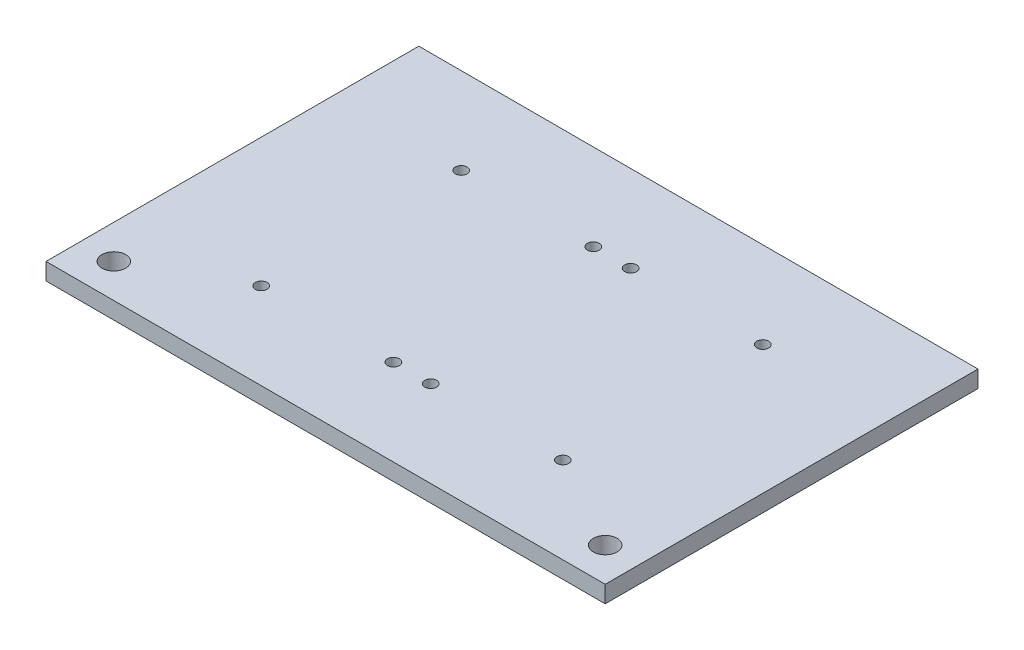
ISO-10303-21;
HEADER;
FILE_DESCRIPTION(('STEP AP214'),'2;1');
FILE_NAME('part.step','',(''),(''),'','','');
FILE_SCHEMA(('AUTOMOTIVE_DESIGN { 1 0 10303 214 1 1 1 1 }'));
ENDSEC;
DATA;
#1=APPLICATION_CONTEXT('core data for automotive mechanical design processes');
#2=APPLICATION_PROTOCOL_DEFINITION('international standard','automotive_design',2000,#1);
#3=PRODUCT_CONTEXT('',#1,'mechanical');
#4=PRODUCT('Part','Part','',(#3));
#5=PRODUCT_RELATED_PRODUCT_CATEGORY('part','',(#4));
#6=PRODUCT_DEFINITION_FORMATION('','',#4);
#7=PRODUCT_DEFINITION_CONTEXT('part definition',#1,'design');
#8=PRODUCT_DEFINITION('design','',#6,#7);
#9=PRODUCT_DEFINITION_SHAPE('','',#8);
#10=(LENGTH_UNIT() NAMED_UNIT(*) SI_UNIT(.MILLI.,.METRE.));
#11=(NAMED_UNIT(*) PLANE_ANGLE_UNIT() SI_UNIT($,.RADIAN.));
#12=(NAMED_UNIT(*) SI_UNIT($,.STERADIAN.) SOLID_ANGLE_UNIT());
#13=UNCERTAINTY_MEASURE_WITH_UNIT(LENGTH_MEASURE(1.E-05),#10,'distance_accuracy_value','');
#14=(GEOMETRIC_REPRESENTATION_CONTEXT(3) GLOBAL_UNCERTAINTY_ASSIGNED_CONTEXT((#13)) GLOBAL_UNIT_ASSIGNED_CONTEXT((#10,
#11,#12)) REPRESENTATION_CONTEXT('',''));
#15=CARTESIAN_POINT('',(0.,0.,0.));
#16=DIRECTION('',(0.,0.,1.));
#17=DIRECTION('',(1.,0.,0.));
#18=AXIS2_PLACEMENT_3D('',#15,#16,#17);
#19=CARTESIAN_POINT('',(0.,5.,0.));
#20=DIRECTION('',(0.,1.,0.));
#21=DIRECTION('',(0.,0.,1.));
#22=AXIS2_PLACEMENT_3D('',#19,#20,#21);
#23=PLANE('',#22);
#24=CARTESIAN_POINT('',(5.50000000000001,5.,-29.5));
#25=DIRECTION('',(0.,1.,0.));
#26=DIRECTION('',(0.,0.,1.));
#27=AXIS2_PLACEMENT_3D('',#24,#25,#26);
#28=CIRCLE('',#27,1.75);
#29=CARTESIAN_POINT('',(5.50000000000001,5.,-27.75));
#30=VERTEX_POINT('',#29);
#31=EDGE_CURVE('E192',#30,#30,#28,.T.);
#32=ORIENTED_EDGE('',*,*,#31,.F.);
#33=EDGE_LOOP('',(#32));
#34=FACE_BOUND('',#33,.T.);
#35=CARTESIAN_POINT('',(44.5,5.,29.5));
#36=DIRECTION('',(0.,1.,0.));
#37=DIRECTION('',(0.,0.,1.));
#38=AXIS2_PLACEMENT_3D('',#35,#36,#37);
#39=CIRCLE('',#38,1.75);
#40=CARTESIAN_POINT('',(44.5,5.,31.25));
#41=VERTEX_POINT('',#40);
#42=EDGE_CURVE('E176',#41,#41,#39,.T.);
#43=ORIENTED_EDGE('',*,*,#42,.F.);
#44=EDGE_LOOP('',(#43));
#45=FACE_BOUND('',#44,.T.);
#46=CARTESIAN_POINT('',(5.5,5.,29.5));
#47=DIRECTION('',(0.,1.,0.));
#48=DIRECTION('',(0.,0.,1.));
#49=AXIS2_PLACEMENT_3D('',#46,#47,#48);
#50=CIRCLE('',#49,1.75);
#51=CARTESIAN_POINT('',(5.5,5.,31.25));
#52=VERTEX_POINT('',#51);
#53=EDGE_CURVE('E160',#52,#52,#50,.T.);
#54=ORIENTED_EDGE('',*,*,#53,.F.);
#55=EDGE_LOOP('',(#54));
#56=FACE_BOUND('',#55,.T.);
#57=CARTESIAN_POINT('',(-44.5,5.,29.5000000000004));
#58=DIRECTION('',(0.,1.,0.));
#59=DIRECTION('',(0.,0.,1.));
#60=AXIS2_PLACEMENT_3D('',#57,#58,#59);
#61=CIRCLE('',#60,1.75);
#62=CARTESIAN_POINT('',(-44.5,5.,31.2500000000004));
#63=VERTEX_POINT('',#62);
#64=EDGE_CURVE('E144',#63,#63,#61,.T.);
#65=ORIENTED_EDGE('',*,*,#64,.F.);
#66=EDGE_LOOP('',(#65));
#67=FACE_BOUND('',#66,.T.);
#68=CARTESIAN_POINT('',(72.5,5.,45.));
#69=DIRECTION('',(0.,1.,0.));
#70=DIRECTION('',(0.,0.,1.));
#71=AXIS2_PLACEMENT_3D('',#68,#69,#70);
#72=CIRCLE('',#71,3.50000000000001);
#73=CARTESIAN_POINT('',(72.5,5.,48.5));
#74=VERTEX_POINT('',#73);
#75=EDGE_CURVE('E114',#74,#74,#72,.T.);
#76=ORIENTED_EDGE('',*,*,#75,.F.);
#77=EDGE_LOOP('',(#76));
#78=FACE_BOUND('',#77,.T.);
#79=DIRECTION('',(0.,0.,-1.));
#80=VECTOR('',#79,1.);
#81=CARTESIAN_POINT('',(82.5,5.,-55.));
#82=LINE('',#81,#80);
#83=CARTESIAN_POINT('',(82.5,5.,55.));
#84=VERTEX_POINT('',#83);
#85=CARTESIAN_POINT('',(82.5,5.,-55.));
#86=VERTEX_POINT('',#85);
#87=EDGE_CURVE('E94',#84,#86,#82,.T.);
#88=ORIENTED_EDGE('',*,*,#87,.T.);
#89=DIRECTION('',(-1.,0.,0.));
#90=VECTOR('',#89,1.);
#91=CARTESIAN_POINT('',(82.5,5.,-55.));
#92=LINE('',#91,#90);
#93=CARTESIAN_POINT('',(-82.5,5.,-55.));
#94=VERTEX_POINT('',#93);
#95=EDGE_CURVE('E89',#86,#94,#92,.T.);
#96=ORIENTED_EDGE('',*,*,#95,.T.);
#97=DIRECTION('',(0.,0.,1.));
#98=VECTOR('',#97,1.);
#99=CARTESIAN_POINT('',(-82.5,5.,-55.));
#100=LINE('',#99,#98);
#101=CARTESIAN_POINT('',(-82.5,5.,55.));
#102=VERTEX_POINT('',#101);
#103=EDGE_CURVE('E92',#94,#102,#100,.T.);
#104=ORIENTED_EDGE('',*,*,#103,.T.);
#105=DIRECTION('',(1.,0.,0.));
#106=VECTOR('',#105,1.);
#107=CARTESIAN_POINT('',(-82.5,5.,55.));
#108=LINE('',#107,#106);
#109=EDGE_CURVE('E59',#102,#84,#108,.T.);
#110=ORIENTED_EDGE('',*,*,#109,.T.);
#111=EDGE_LOOP('',(#88,#96,#104,#110));
#112=FACE_BOUND('',#111,.T.);
#113=CARTESIAN_POINT('',(-72.5,5.,45.));
#114=DIRECTION('',(0.,1.,0.));
#115=DIRECTION('',(0.,0.,1.));
#116=AXIS2_PLACEMENT_3D('',#113,#114,#115);
#117=CIRCLE('',#116,3.50000000000001);
#118=CARTESIAN_POINT('',(-72.5,5.,48.5));
#119=VERTEX_POINT('',#118);
#120=EDGE_CURVE('E136',#119,#119,#117,.T.);
#121=ORIENTED_EDGE('',*,*,#120,.F.);
#122=EDGE_LOOP('',(#121));
#123=FACE_BOUND('',#122,.T.);
#124=CARTESIAN_POINT('',(-5.5,5.,29.5000000000003));
#125=DIRECTION('',(0.,1.,0.));
#126=DIRECTION('',(0.,0.,1.));
#127=AXIS2_PLACEMENT_3D('',#124,#125,#126);
#128=CIRCLE('',#127,1.75);
#129=CARTESIAN_POINT('',(-5.5,5.,31.2500000000004));
#130=VERTEX_POINT('',#129);
#131=EDGE_CURVE('E152',#130,#130,#128,.T.);
#132=ORIENTED_EDGE('',*,*,#131,.F.);
#133=EDGE_LOOP('',(#132));
#134=FACE_BOUND('',#133,.T.);
#135=CARTESIAN_POINT('',(-44.5,5.,-29.4999999999996));
#136=DIRECTION('',(0.,1.,0.));
#137=DIRECTION('',(0.,0.,1.));
#138=AXIS2_PLACEMENT_3D('',#135,#136,#137);
#139=CIRCLE('',#138,1.75000000000001);
#140=CARTESIAN_POINT('',(-44.5,5.,-27.7499999999996));
#141=VERTEX_POINT('',#140);
#142=EDGE_CURVE('E168',#141,#141,#139,.T.);
#143=ORIENTED_EDGE('',*,*,#142,.F.);
#144=EDGE_LOOP('',(#143));
#145=FACE_BOUND('',#144,.T.);
#146=CARTESIAN_POINT('',(-5.50000000000001,5.,-29.4999999999996));
#147=DIRECTION('',(0.,1.,0.));
#148=DIRECTION('',(0.,0.,1.));
#149=AXIS2_PLACEMENT_3D('',#146,#147,#148);
#150=CIRCLE('',#149,1.75);
#151=CARTESIAN_POINT('',(-5.50000000000001,5.,-27.7499999999996));
#152=VERTEX_POINT('',#151);
#153=EDGE_CURVE('E184',#152,#152,#150,.T.);
#154=ORIENTED_EDGE('',*,*,#153,.F.);
#155=EDGE_LOOP('',(#154));
#156=FACE_BOUND('',#155,.T.);
#157=CARTESIAN_POINT('',(44.5,5.,-29.5));
#158=DIRECTION('',(0.,1.,0.));
#159=DIRECTION('',(0.,0.,1.));
#160=AXIS2_PLACEMENT_3D('',#157,#158,#159);
#161=CIRCLE('',#160,1.75);
#162=CARTESIAN_POINT('',(44.5,5.,-27.75));
#163=VERTEX_POINT('',#162);
#164=EDGE_CURVE('E200',#163,#163,#161,.T.);
#165=ORIENTED_EDGE('',*,*,#164,.F.);
#166=EDGE_LOOP('',(#165));
#167=FACE_BOUND('',#166,.T.);
#168=ADVANCED_FACE('F41',(#34,#45,#56,#67,#78,#112,#123,#134,#145,#156,#167),#23,.T.);
#169=CARTESIAN_POINT('',(0.,0.,0.));
#170=DIRECTION('',(0.,1.,0.));
#171=DIRECTION('',(0.,0.,1.));
#172=AXIS2_PLACEMENT_3D('',#169,#170,#171);
#173=PLANE('',#172);
#174=DIRECTION('',(0.,0.,-1.));
#175=VECTOR('',#174,1.);
#176=CARTESIAN_POINT('',(82.5,0.,-55.));
#177=LINE('',#176,#175);
#178=CARTESIAN_POINT('',(82.5,0.,55.));
#179=VERTEX_POINT('',#178);
#180=CARTESIAN_POINT('',(82.5,0.,-55.));
#181=VERTEX_POINT('',#180);
#182=EDGE_CURVE('E110',#179,#181,#177,.T.);
#183=ORIENTED_EDGE('',*,*,#182,.F.);
#184=DIRECTION('',(1.,0.,0.));
#185=VECTOR('',#184,1.);
#186=CARTESIAN_POINT('',(-82.5,0.,55.));
#187=LINE('',#186,#185);
#188=CARTESIAN_POINT('',(-82.5,0.,55.));
#189=VERTEX_POINT('',#188);
#190=EDGE_CURVE('E82',#189,#179,#187,.T.);
#191=ORIENTED_EDGE('',*,*,#190,.F.);
#192=DIRECTION('',(0.,0.,1.));
#193=VECTOR('',#192,1.);
#194=CARTESIAN_POINT('',(-82.5,0.,-55.));
#195=LINE('',#194,#193);
#196=CARTESIAN_POINT('',(-82.5,0.,-55.));
#197=VERTEX_POINT('',#196);
#198=EDGE_CURVE('E76',#197,#189,#195,.T.);
#199=ORIENTED_EDGE('',*,*,#198,.F.);
#200=DIRECTION('',(-1.,0.,0.));
#201=VECTOR('',#200,1.);
#202=CARTESIAN_POINT('',(82.5,0.,-55.));
#203=LINE('',#202,#201);
#204=EDGE_CURVE('E99',#181,#197,#203,.T.);
#205=ORIENTED_EDGE('',*,*,#204,.F.);
#206=EDGE_LOOP('',(#183,#191,#199,#205));
#207=FACE_BOUND('',#206,.T.);
#208=CARTESIAN_POINT('',(72.5,0.,45.));
#209=DIRECTION('',(0.,1.,0.));
#210=DIRECTION('',(0.,0.,1.));
#211=AXIS2_PLACEMENT_3D('',#208,#209,#210);
#212=CIRCLE('',#211,3.50000000000001);
#213=CARTESIAN_POINT('',(72.5,0.,48.5));
#214=VERTEX_POINT('',#213);
#215=EDGE_CURVE('E132',#214,#214,#212,.T.);
#216=ORIENTED_EDGE('',*,*,#215,.T.);
#217=EDGE_LOOP('',(#216));
#218=FACE_BOUND('',#217,.T.);
#219=CARTESIAN_POINT('',(-72.5,0.,45.));
#220=DIRECTION('',(0.,1.,0.));
#221=DIRECTION('',(0.,0.,1.));
#222=AXIS2_PLACEMENT_3D('',#219,#220,#221);
#223=CIRCLE('',#222,3.50000000000001);
#224=CARTESIAN_POINT('',(-72.5,0.,48.5));
#225=VERTEX_POINT('',#224);
#226=EDGE_CURVE('E140',#225,#225,#223,.T.);
#227=ORIENTED_EDGE('',*,*,#226,.T.);
#228=EDGE_LOOP('',(#227));
#229=FACE_BOUND('',#228,.T.);
#230=CARTESIAN_POINT('',(-44.5,0.,29.5000000000004));
#231=DIRECTION('',(0.,1.,0.));
#232=DIRECTION('',(0.,0.,1.));
#233=AXIS2_PLACEMENT_3D('',#230,#231,#232);
#234=CIRCLE('',#233,1.75);
#235=CARTESIAN_POINT('',(-44.5,0.,31.2500000000004));
#236=VERTEX_POINT('',#235);
#237=EDGE_CURVE('E148',#236,#236,#234,.T.);
#238=ORIENTED_EDGE('',*,*,#237,.T.);
#239=EDGE_LOOP('',(#238));
#240=FACE_BOUND('',#239,.T.);
#241=CARTESIAN_POINT('',(-5.5,0.,29.5000000000003));
#242=DIRECTION('',(0.,1.,0.));
#243=DIRECTION('',(0.,0.,1.));
#244=AXIS2_PLACEMENT_3D('',#241,#242,#243);
#245=CIRCLE('',#244,1.75);
#246=CARTESIAN_POINT('',(-5.5,0.,31.2500000000004));
#247=VERTEX_POINT('',#246);
#248=EDGE_CURVE('E156',#247,#247,#245,.T.);
#249=ORIENTED_EDGE('',*,*,#248,.T.);
#250=EDGE_LOOP('',(#249));
#251=FACE_BOUND('',#250,.T.);
#252=CARTESIAN_POINT('',(5.5,0.,29.5));
#253=DIRECTION('',(0.,1.,0.));
#254=DIRECTION('',(0.,0.,1.));
#255=AXIS2_PLACEMENT_3D('',#252,#253,#254);
#256=CIRCLE('',#255,1.75);
#257=CARTESIAN_POINT('',(5.5,0.,31.25));
#258=VERTEX_POINT('',#257);
#259=EDGE_CURVE('E164',#258,#258,#256,.T.);
#260=ORIENTED_EDGE('',*,*,#259,.T.);
#261=EDGE_LOOP('',(#260));
#262=FACE_BOUND('',#261,.T.);
#263=CARTESIAN_POINT('',(-44.5,0.,-29.4999999999996));
#264=DIRECTION('',(0.,1.,0.));
#265=DIRECTION('',(0.,0.,1.));
#266=AXIS2_PLACEMENT_3D('',#263,#264,#265);
#267=CIRCLE('',#266,1.75000000000001);
#268=CARTESIAN_POINT('',(-44.5,0.,-27.7499999999996));
#269=VERTEX_POINT('',#268);
#270=EDGE_CURVE('E172',#269,#269,#267,.T.);
#271=ORIENTED_EDGE('',*,*,#270,.T.);
#272=EDGE_LOOP('',(#271));
#273=FACE_BOUND('',#272,.T.);
#274=CARTESIAN_POINT('',(44.5,0.,29.5));
#275=DIRECTION('',(0.,1.,0.));
#276=DIRECTION('',(0.,0.,1.));
#277=AXIS2_PLACEMENT_3D('',#274,#275,#276);
#278=CIRCLE('',#277,1.75);
#279=CARTESIAN_POINT('',(44.5,0.,31.25));
#280=VERTEX_POINT('',#279);
#281=EDGE_CURVE('E180',#280,#280,#278,.T.);
#282=ORIENTED_EDGE('',*,*,#281,.T.);
#283=EDGE_LOOP('',(#282));
#284=FACE_BOUND('',#283,.T.);
#285=CARTESIAN_POINT('',(-5.50000000000001,0.,-29.4999999999996));
#286=DIRECTION('',(0.,1.,0.));
#287=DIRECTION('',(0.,0.,1.));
#288=AXIS2_PLACEMENT_3D('',#285,#286,#287);
#289=CIRCLE('',#288,1.75);
#290=CARTESIAN_POINT('',(-5.50000000000001,0.,-27.7499999999996));
#291=VERTEX_POINT('',#290);
#292=EDGE_CURVE('E188',#291,#291,#289,.T.);
#293=ORIENTED_EDGE('',*,*,#292,.T.);
#294=EDGE_LOOP('',(#293));
#295=FACE_BOUND('',#294,.T.);
#296=CARTESIAN_POINT('',(5.50000000000001,0.,-29.5));
#297=DIRECTION('',(0.,1.,0.));
#298=DIRECTION('',(0.,0.,1.));
#299=AXIS2_PLACEMENT_3D('',#296,#297,#298);
#300=CIRCLE('',#299,1.75);
#301=CARTESIAN_POINT('',(5.50000000000001,0.,-27.75));
#302=VERTEX_POINT('',#301);
#303=EDGE_CURVE('E196',#302,#302,#300,.T.);
#304=ORIENTED_EDGE('',*,*,#303,.T.);
#305=EDGE_LOOP('',(#304));
#306=FACE_BOUND('',#305,.T.);
#307=CARTESIAN_POINT('',(44.5,0.,-29.5));
#308=DIRECTION('',(0.,1.,0.));
#309=DIRECTION('',(0.,0.,1.));
#310=AXIS2_PLACEMENT_3D('',#307,#308,#309);
#311=CIRCLE('',#310,1.75);
#312=CARTESIAN_POINT('',(44.5,0.,-27.75));
#313=VERTEX_POINT('',#312);
#314=EDGE_CURVE('E204',#313,#313,#311,.T.);
#315=ORIENTED_EDGE('',*,*,#314,.T.);
#316=EDGE_LOOP('',(#315));
#317=FACE_BOUND('',#316,.T.);
#318=ADVANCED_FACE('F127',(#207,#218,#229,#240,#251,#262,#273,#284,#295,#306,#317),#173,.F.);
#319=CARTESIAN_POINT('',(82.5,5.,-55.));
#320=DIRECTION('',(-1.,0.,0.));
#321=DIRECTION('',(0.,0.,1.));
#322=AXIS2_PLACEMENT_3D('',#319,#320,#321);
#323=PLANE('',#322);
#324=ORIENTED_EDGE('',*,*,#182,.T.);
#325=DIRECTION('',(0.,-1.,0.));
#326=VECTOR('',#325,1.);
#327=CARTESIAN_POINT('',(82.5,5.,-55.));
#328=LINE('',#327,#326);
#329=EDGE_CURVE('E11',#86,#181,#328,.T.);
#330=ORIENTED_EDGE('',*,*,#329,.F.);
#331=ORIENTED_EDGE('',*,*,#87,.F.);
#332=DIRECTION('',(0.,-1.,0.));
#333=VECTOR('',#332,1.);
#334=CARTESIAN_POINT('',(82.5,5.,55.));
#335=LINE('',#334,#333);
#336=EDGE_CURVE('E106',#84,#179,#335,.T.);
#337=ORIENTED_EDGE('',*,*,#336,.T.);
#338=EDGE_LOOP('',(#324,#330,#331,#337));
#339=FACE_BOUND('',#338,.T.);
#340=ADVANCED_FACE('F43',(#339),#323,.F.);
#341=CARTESIAN_POINT('',(82.5,5.,-55.));
#342=DIRECTION('',(0.,0.,1.));
#343=DIRECTION('',(1.,0.,0.));
#344=AXIS2_PLACEMENT_3D('',#341,#342,#343);
#345=PLANE('',#344);
#346=ORIENTED_EDGE('',*,*,#204,.T.);
#347=DIRECTION('',(0.,-1.,0.));
#348=VECTOR('',#347,1.);
#349=CARTESIAN_POINT('',(-82.5,5.,-55.));
#350=LINE('',#349,#348);
#351=EDGE_CURVE('E51',#94,#197,#350,.T.);
#352=ORIENTED_EDGE('',*,*,#351,.F.);
#353=ORIENTED_EDGE('',*,*,#95,.F.);
#354=ORIENTED_EDGE('',*,*,#329,.T.);
#355=EDGE_LOOP('',(#346,#352,#353,#354));
#356=FACE_BOUND('',#355,.T.);
#357=ADVANCED_FACE('F98',(#356),#345,.F.);
#358=CARTESIAN_POINT('',(-82.5,5.,-55.));
#359=DIRECTION('',(1.,0.,0.));
#360=DIRECTION('',(0.,0.,-1.));
#361=AXIS2_PLACEMENT_3D('',#358,#359,#360);
#362=PLANE('',#361);
#363=ORIENTED_EDGE('',*,*,#198,.T.);
#364=DIRECTION('',(0.,-1.,0.));
#365=VECTOR('',#364,1.);
#366=CARTESIAN_POINT('',(-82.5,5.,55.));
#367=LINE('',#366,#365);
#368=EDGE_CURVE('E101',#102,#189,#367,.T.);
#369=ORIENTED_EDGE('',*,*,#368,.F.);
#370=ORIENTED_EDGE('',*,*,#103,.F.);
#371=ORIENTED_EDGE('',*,*,#351,.T.);
#372=EDGE_LOOP('',(#363,#369,#370,#371));
#373=FACE_BOUND('',#372,.T.);
#374=ADVANCED_FACE('F102',(#373),#362,.F.);
#375=CARTESIAN_POINT('',(-82.5,5.,55.));
#376=DIRECTION('',(0.,0.,-1.));
#377=DIRECTION('',(-1.,0.,0.));
#378=AXIS2_PLACEMENT_3D('',#375,#376,#377);
#379=PLANE('',#378);
#380=ORIENTED_EDGE('',*,*,#190,.T.);
#381=ORIENTED_EDGE('',*,*,#336,.F.);
#382=ORIENTED_EDGE('',*,*,#109,.F.);
#383=ORIENTED_EDGE('',*,*,#368,.T.);
#384=EDGE_LOOP('',(#380,#381,#382,#383));
#385=FACE_BOUND('',#384,.T.);
#386=ADVANCED_FACE('F124',(#385),#379,.F.);
#387=CARTESIAN_POINT('',(72.5,5.,45.));
#388=DIRECTION('',(0.,-1.,0.));
#389=DIRECTION('',(0.,0.,-1.));
#390=AXIS2_PLACEMENT_3D('',#387,#388,#389);
#391=CYLINDRICAL_SURFACE('',#390,3.50000000000001);
#392=ORIENTED_EDGE('',*,*,#75,.T.);
#393=EDGE_LOOP('',(#392));
#394=FACE_BOUND('',#393,.T.);
#395=ORIENTED_EDGE('',*,*,#215,.F.);
#396=EDGE_LOOP('',(#395));
#397=FACE_BOUND('',#396,.T.);
#398=ADVANCED_FACE('F225',(#394,#397),#391,.F.);
#399=CARTESIAN_POINT('',(-72.5,5.,45.));
#400=DIRECTION('',(0.,-1.,0.));
#401=DIRECTION('',(0.,0.,-1.));
#402=AXIS2_PLACEMENT_3D('',#399,#400,#401);
#403=CYLINDRICAL_SURFACE('',#402,3.50000000000001);
#404=ORIENTED_EDGE('',*,*,#120,.T.);
#405=EDGE_LOOP('',(#404));
#406=FACE_BOUND('',#405,.T.);
#407=ORIENTED_EDGE('',*,*,#226,.F.);
#408=EDGE_LOOP('',(#407));
#409=FACE_BOUND('',#408,.T.);
#410=ADVANCED_FACE('F271',(#406,#409),#403,.F.);
#411=CARTESIAN_POINT('',(-44.5,5.,29.5000000000004));
#412=DIRECTION('',(0.,-1.,0.));
#413=DIRECTION('',(0.,0.,-1.));
#414=AXIS2_PLACEMENT_3D('',#411,#412,#413);
#415=CYLINDRICAL_SURFACE('',#414,1.75);
#416=ORIENTED_EDGE('',*,*,#64,.T.);
#417=EDGE_LOOP('',(#416));
#418=FACE_BOUND('',#417,.T.);
#419=ORIENTED_EDGE('',*,*,#237,.F.);
#420=EDGE_LOOP('',(#419));
#421=FACE_BOUND('',#420,.T.);
#422=ADVANCED_FACE('F279',(#418,#421),#415,.F.);
#423=CARTESIAN_POINT('',(-5.5,5.,29.5000000000003));
#424=DIRECTION('',(0.,-1.,0.));
#425=DIRECTION('',(0.,0.,-1.));
#426=AXIS2_PLACEMENT_3D('',#423,#424,#425);
#427=CYLINDRICAL_SURFACE('',#426,1.75);
#428=ORIENTED_EDGE('',*,*,#131,.T.);
#429=EDGE_LOOP('',(#428));
#430=FACE_BOUND('',#429,.T.);
#431=ORIENTED_EDGE('',*,*,#248,.F.);
#432=EDGE_LOOP('',(#431));
#433=FACE_BOUND('',#432,.T.);
#434=ADVANCED_FACE('F287',(#430,#433),#427,.F.);
#435=CARTESIAN_POINT('',(5.5,5.,29.5));
#436=DIRECTION('',(0.,-1.,0.));
#437=DIRECTION('',(0.,0.,-1.));
#438=AXIS2_PLACEMENT_3D('',#435,#436,#437);
#439=CYLINDRICAL_SURFACE('',#438,1.75);
#440=ORIENTED_EDGE('',*,*,#53,.T.);
#441=EDGE_LOOP('',(#440));
#442=FACE_BOUND('',#441,.T.);
#443=ORIENTED_EDGE('',*,*,#259,.F.);
#444=EDGE_LOOP('',(#443));
#445=FACE_BOUND('',#444,.T.);
#446=ADVANCED_FACE('F296',(#442,#445),#439,.F.);
#447=CARTESIAN_POINT('',(-44.5,5.,-29.4999999999996));
#448=DIRECTION('',(0.,-1.,0.));
#449=DIRECTION('',(0.,0.,-1.));
#450=AXIS2_PLACEMENT_3D('',#447,#448,#449);
#451=CYLINDRICAL_SURFACE('',#450,1.75000000000001);
#452=ORIENTED_EDGE('',*,*,#142,.T.);
#453=EDGE_LOOP('',(#452));
#454=FACE_BOUND('',#453,.T.);
#455=ORIENTED_EDGE('',*,*,#270,.F.);
#456=EDGE_LOOP('',(#455));
#457=FACE_BOUND('',#456,.T.);
#458=ADVANCED_FACE('F305',(#454,#457),#451,.F.);
#459=CARTESIAN_POINT('',(44.5,5.,29.5));
#460=DIRECTION('',(0.,-1.,0.));
#461=DIRECTION('',(0.,0.,-1.));
#462=AXIS2_PLACEMENT_3D('',#459,#460,#461);
#463=CYLINDRICAL_SURFACE('',#462,1.75);
#464=ORIENTED_EDGE('',*,*,#42,.T.);
#465=EDGE_LOOP('',(#464));
#466=FACE_BOUND('',#465,.T.);
#467=ORIENTED_EDGE('',*,*,#281,.F.);
#468=EDGE_LOOP('',(#467));
#469=FACE_BOUND('',#468,.T.);
#470=ADVANCED_FACE('F314',(#466,#469),#463,.F.);
#471=CARTESIAN_POINT('',(-5.50000000000001,5.,-29.4999999999996));
#472=DIRECTION('',(0.,-1.,0.));
#473=DIRECTION('',(0.,0.,-1.));
#474=AXIS2_PLACEMENT_3D('',#471,#472,#473);
#475=CYLINDRICAL_SURFACE('',#474,1.75);
#476=ORIENTED_EDGE('',*,*,#153,.T.);
#477=EDGE_LOOP('',(#476));
#478=FACE_BOUND('',#477,.T.);
#479=ORIENTED_EDGE('',*,*,#292,.F.);
#480=EDGE_LOOP('',(#479));
#481=FACE_BOUND('',#480,.T.);
#482=ADVANCED_FACE('F323',(#478,#481),#475,.F.);
#483=CARTESIAN_POINT('',(5.50000000000001,5.,-29.5));
#484=DIRECTION('',(0.,-1.,0.));
#485=DIRECTION('',(0.,0.,-1.));
#486=AXIS2_PLACEMENT_3D('',#483,#484,#485);
#487=CYLINDRICAL_SURFACE('',#486,1.75);
#488=ORIENTED_EDGE('',*,*,#31,.T.);
#489=EDGE_LOOP('',(#488));
#490=FACE_BOUND('',#489,.T.);
#491=ORIENTED_EDGE('',*,*,#303,.F.);
#492=EDGE_LOOP('',(#491));
#493=FACE_BOUND('',#492,.T.);
#494=ADVANCED_FACE('F332',(#490,#493),#487,.F.);
#495=CARTESIAN_POINT('',(44.5,5.,-29.5));
#496=DIRECTION('',(0.,-1.,0.));
#497=DIRECTION('',(0.,0.,-1.));
#498=AXIS2_PLACEMENT_3D('',#495,#496,#497);
#499=CYLINDRICAL_SURFACE('',#498,1.75);
#500=ORIENTED_EDGE('',*,*,#164,.T.);
#501=EDGE_LOOP('',(#500));
#502=FACE_BOUND('',#501,.T.);
#503=ORIENTED_EDGE('',*,*,#314,.F.);
#504=EDGE_LOOP('',(#503));
#505=FACE_BOUND('',#504,.T.);
#506=ADVANCED_FACE('F212',(#502,#505),#499,.F.);
#507=CLOSED_SHELL('',(#168,#318,#340,#357,#374,#386,#398,#410,#422,#434,#446,#458,#470,#482,
#494,#506));
#508=MANIFOLD_SOLID_BREP('B2',#507);
#509=ADVANCED_BREP_SHAPE_REPRESENTATION('',(#18,#508),#14);
#510=SHAPE_DEFINITION_REPRESENTATION(#9,#509);
ENDSEC;
END-ISO-10303-21;
